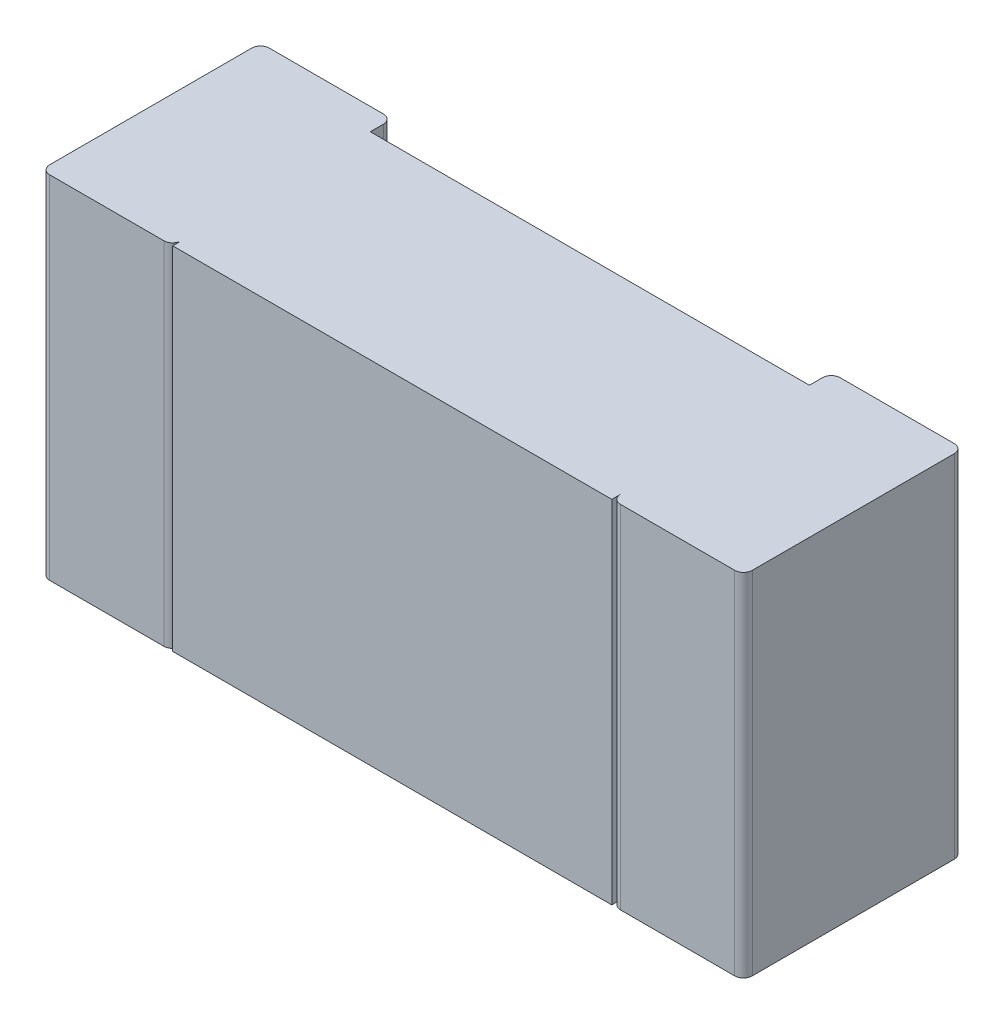
ISO-10303-21;
HEADER;
FILE_DESCRIPTION(('STEP AP214'),'2;1');
FILE_NAME('part.step','',(''),(''),'','','');
FILE_SCHEMA(('AUTOMOTIVE_DESIGN { 1 0 10303 214 1 1 1 1 }'));
ENDSEC;
DATA;
#1=APPLICATION_CONTEXT('core data for automotive mechanical design processes');
#2=APPLICATION_PROTOCOL_DEFINITION('international standard','automotive_design',2000,#1);
#3=PRODUCT_CONTEXT('',#1,'mechanical');
#4=PRODUCT('Part','Part','',(#3));
#5=PRODUCT_RELATED_PRODUCT_CATEGORY('part','',(#4));
#6=PRODUCT_DEFINITION_FORMATION('','',#4);
#7=PRODUCT_DEFINITION_CONTEXT('part definition',#1,'design');
#8=PRODUCT_DEFINITION('design','',#6,#7);
#9=PRODUCT_DEFINITION_SHAPE('','',#8);
#10=(LENGTH_UNIT() NAMED_UNIT(*) SI_UNIT(.MILLI.,.METRE.));
#11=(NAMED_UNIT(*) PLANE_ANGLE_UNIT() SI_UNIT($,.RADIAN.));
#12=(NAMED_UNIT(*) SI_UNIT($,.STERADIAN.) SOLID_ANGLE_UNIT());
#13=UNCERTAINTY_MEASURE_WITH_UNIT(LENGTH_MEASURE(1.E-05),#10,'distance_accuracy_value','');
#14=(GEOMETRIC_REPRESENTATION_CONTEXT(3) GLOBAL_UNCERTAINTY_ASSIGNED_CONTEXT((#13)) GLOBAL_UNIT_ASSIGNED_CONTEXT((#10,
#11,#12)) REPRESENTATION_CONTEXT('',''));
#15=CARTESIAN_POINT('',(0.,0.,0.));
#16=DIRECTION('',(0.,0.,1.));
#17=DIRECTION('',(1.,0.,0.));
#18=AXIS2_PLACEMENT_3D('',#15,#16,#17);
#19=CARTESIAN_POINT('',(-0.8,-0.4,0.));
#20=DIRECTION('',(0.,0.,1.));
#21=DIRECTION('',(1.,0.,0.));
#22=AXIS2_PLACEMENT_3D('',#19,#20,#21);
#23=PLANE('',#22);
#24=DIRECTION('',(1.,0.,0.));
#25=VECTOR('',#24,1.);
#26=CARTESIAN_POINT('',(-0.8,-0.4,0.));
#27=LINE('',#26,#25);
#28=CARTESIAN_POINT('',(-0.52,-0.4,0.));
#29=VERTEX_POINT('',#28);
#30=CARTESIAN_POINT('',(-0.78,-0.4,0.));
#31=VERTEX_POINT('',#30);
#32=EDGE_CURVE('E176',#29,#31,#27,.F.);
#33=ORIENTED_EDGE('',*,*,#32,.T.);
#34=DIRECTION('',(0.,1.,0.));
#35=VECTOR('',#34,1.);
#36=CARTESIAN_POINT('',(-0.78,-0.4,0.));
#37=LINE('',#36,#35);
#38=CARTESIAN_POINT('',(-0.78,0.4,0.));
#39=VERTEX_POINT('',#38);
#40=EDGE_CURVE('E151',#39,#31,#37,.F.);
#41=ORIENTED_EDGE('',*,*,#40,.F.);
#42=DIRECTION('',(1.,0.,0.));
#43=VECTOR('',#42,1.);
#44=CARTESIAN_POINT('',(-0.8,0.4,0.));
#45=LINE('',#44,#43);
#46=CARTESIAN_POINT('',(-0.52,0.4,0.));
#47=VERTEX_POINT('',#46);
#48=EDGE_CURVE('E286',#47,#39,#45,.F.);
#49=ORIENTED_EDGE('',*,*,#48,.F.);
#50=DIRECTION('',(0.,1.,0.));
#51=VECTOR('',#50,1.);
#52=CARTESIAN_POINT('',(-0.52,-0.4,0.));
#53=LINE('',#52,#51);
#54=EDGE_CURVE('E177',#29,#47,#53,.T.);
#55=ORIENTED_EDGE('',*,*,#54,.F.);
#56=EDGE_LOOP('',(#33,#41,#49,#55));
#57=FACE_BOUND('',#56,.T.);
#58=ADVANCED_FACE('F17',(#57),#23,.F.);
#59=CARTESIAN_POINT('',(-0.78,-0.4,0.02));
#60=DIRECTION('',(0.,1.,0.));
#61=DIRECTION('',(0.,0.,1.));
#62=AXIS2_PLACEMENT_3D('',#59,#60,#61);
#63=CYLINDRICAL_SURFACE('',#62,0.02);
#64=ORIENTED_EDGE('',*,*,#40,.T.);
#65=CARTESIAN_POINT('',(-0.78,-0.4,0.02));
#66=DIRECTION('',(0.,1.,0.));
#67=DIRECTION('',(0.,0.,1.));
#68=AXIS2_PLACEMENT_3D('',#65,#66,#67);
#69=CIRCLE('',#68,0.02);
#70=CARTESIAN_POINT('',(-0.8,-0.4,0.02));
#71=VERTEX_POINT('',#70);
#72=EDGE_CURVE('E20',#31,#71,#69,.T.);
#73=ORIENTED_EDGE('',*,*,#72,.T.);
#74=DIRECTION('',(0.,1.,0.));
#75=VECTOR('',#74,1.);
#76=CARTESIAN_POINT('',(-0.8,-0.4,0.02));
#77=LINE('',#76,#75);
#78=CARTESIAN_POINT('',(-0.8,0.4,0.02));
#79=VERTEX_POINT('',#78);
#80=EDGE_CURVE('E158',#71,#79,#77,.T.);
#81=ORIENTED_EDGE('',*,*,#80,.T.);
#82=CARTESIAN_POINT('',(-0.78,0.4,0.02));
#83=DIRECTION('',(0.,1.,0.));
#84=DIRECTION('',(0.,0.,1.));
#85=AXIS2_PLACEMENT_3D('',#82,#83,#84);
#86=CIRCLE('',#85,0.02);
#87=EDGE_CURVE('E284',#39,#79,#86,.T.);
#88=ORIENTED_EDGE('',*,*,#87,.F.);
#89=EDGE_LOOP('',(#64,#73,#81,#88));
#90=FACE_BOUND('',#89,.T.);
#91=ADVANCED_FACE('F175',(#90),#63,.T.);
#92=CARTESIAN_POINT('',(-0.8,-0.4,0.));
#93=DIRECTION('',(1.,0.,0.));
#94=DIRECTION('',(0.,0.,-1.));
#95=AXIS2_PLACEMENT_3D('',#92,#93,#94);
#96=PLANE('',#95);
#97=DIRECTION('',(0.,0.,1.));
#98=VECTOR('',#97,1.);
#99=CARTESIAN_POINT('',(-0.8,0.4,0.));
#100=LINE('',#99,#98);
#101=CARTESIAN_POINT('',(-0.8,0.4,0.48));
#102=VERTEX_POINT('',#101);
#103=EDGE_CURVE('E163',#79,#102,#100,.T.);
#104=ORIENTED_EDGE('',*,*,#103,.F.);
#105=ORIENTED_EDGE('',*,*,#80,.F.);
#106=DIRECTION('',(0.,0.,1.));
#107=VECTOR('',#106,1.);
#108=CARTESIAN_POINT('',(-0.8,-0.4,0.));
#109=LINE('',#108,#107);
#110=CARTESIAN_POINT('',(-0.8,-0.4,0.48));
#111=VERTEX_POINT('',#110);
#112=EDGE_CURVE('E162',#71,#111,#109,.T.);
#113=ORIENTED_EDGE('',*,*,#112,.T.);
#114=DIRECTION('',(0.,1.,0.));
#115=VECTOR('',#114,1.);
#116=CARTESIAN_POINT('',(-0.8,-0.4,0.48));
#117=LINE('',#116,#115);
#118=EDGE_CURVE('E164',#102,#111,#117,.F.);
#119=ORIENTED_EDGE('',*,*,#118,.F.);
#120=EDGE_LOOP('',(#104,#105,#113,#119));
#121=FACE_BOUND('',#120,.T.);
#122=ADVANCED_FACE('F160',(#121),#96,.F.);
#123=CARTESIAN_POINT('',(-0.78,-0.4,0.48));
#124=DIRECTION('',(0.,1.,0.));
#125=DIRECTION('',(0.,0.,1.));
#126=AXIS2_PLACEMENT_3D('',#123,#124,#125);
#127=CYLINDRICAL_SURFACE('',#126,0.02);
#128=CARTESIAN_POINT('',(-0.78,0.4,0.48));
#129=DIRECTION('',(0.,1.,0.));
#130=DIRECTION('',(0.,0.,1.));
#131=AXIS2_PLACEMENT_3D('',#128,#129,#130);
#132=CIRCLE('',#131,0.02);
#133=CARTESIAN_POINT('',(-0.78,0.4,0.5));
#134=VERTEX_POINT('',#133);
#135=EDGE_CURVE('E282',#102,#134,#132,.T.);
#136=ORIENTED_EDGE('',*,*,#135,.F.);
#137=ORIENTED_EDGE('',*,*,#118,.T.);
#138=CARTESIAN_POINT('',(-0.78,-0.4,0.48));
#139=DIRECTION('',(0.,1.,0.));
#140=DIRECTION('',(0.,0.,1.));
#141=AXIS2_PLACEMENT_3D('',#138,#139,#140);
#142=CIRCLE('',#141,0.02);
#143=CARTESIAN_POINT('',(-0.78,-0.4,0.5));
#144=VERTEX_POINT('',#143);
#145=EDGE_CURVE('E173',#111,#144,#142,.T.);
#146=ORIENTED_EDGE('',*,*,#145,.T.);
#147=DIRECTION('',(0.,1.,0.));
#148=VECTOR('',#147,1.);
#149=CARTESIAN_POINT('',(-0.78,-0.4,0.5));
#150=LINE('',#149,#148);
#151=EDGE_CURVE('E246',#134,#144,#150,.F.);
#152=ORIENTED_EDGE('',*,*,#151,.F.);
#153=EDGE_LOOP('',(#136,#137,#146,#152));
#154=FACE_BOUND('',#153,.T.);
#155=ADVANCED_FACE('F378',(#154),#127,.T.);
#156=CARTESIAN_POINT('',(-0.8,-0.4,0.5));
#157=DIRECTION('',(0.,0.,1.));
#158=DIRECTION('',(1.,0.,0.));
#159=AXIS2_PLACEMENT_3D('',#156,#157,#158);
#160=PLANE('',#159);
#161=DIRECTION('',(1.,0.,0.));
#162=VECTOR('',#161,1.);
#163=CARTESIAN_POINT('',(-0.8,-0.4,0.5));
#164=LINE('',#163,#162);
#165=CARTESIAN_POINT('',(-0.52,-0.4,0.5));
#166=VERTEX_POINT('',#165);
#167=EDGE_CURVE('E302',#144,#166,#164,.T.);
#168=ORIENTED_EDGE('',*,*,#167,.T.);
#169=DIRECTION('',(0.,1.,0.));
#170=VECTOR('',#169,1.);
#171=CARTESIAN_POINT('',(-0.52,-0.4,0.5));
#172=LINE('',#171,#170);
#173=CARTESIAN_POINT('',(-0.52,0.4,0.5));
#174=VERTEX_POINT('',#173);
#175=EDGE_CURVE('E243',#174,#166,#172,.F.);
#176=ORIENTED_EDGE('',*,*,#175,.F.);
#177=DIRECTION('',(1.,0.,0.));
#178=VECTOR('',#177,1.);
#179=CARTESIAN_POINT('',(-0.8,0.4,0.5));
#180=LINE('',#179,#178);
#181=EDGE_CURVE('E281',#134,#174,#180,.T.);
#182=ORIENTED_EDGE('',*,*,#181,.F.);
#183=ORIENTED_EDGE('',*,*,#151,.T.);
#184=EDGE_LOOP('',(#168,#176,#182,#183));
#185=FACE_BOUND('',#184,.T.);
#186=ADVANCED_FACE('F380',(#185),#160,.T.);
#187=CARTESIAN_POINT('',(-0.52,-0.4,0.48));
#188=DIRECTION('',(0.,1.,0.));
#189=DIRECTION('',(0.,0.,1.));
#190=AXIS2_PLACEMENT_3D('',#187,#188,#189);
#191=CYLINDRICAL_SURFACE('',#190,0.02);
#192=ORIENTED_EDGE('',*,*,#175,.T.);
#193=CARTESIAN_POINT('',(-0.52,-0.4,0.48));
#194=DIRECTION('',(0.,1.,0.));
#195=DIRECTION('',(0.,0.,1.));
#196=AXIS2_PLACEMENT_3D('',#193,#194,#195);
#197=CIRCLE('',#196,0.02);
#198=CARTESIAN_POINT('',(-0.5,-0.4,0.48));
#199=VERTEX_POINT('',#198);
#200=EDGE_CURVE('E300',#166,#199,#197,.T.);
#201=ORIENTED_EDGE('',*,*,#200,.T.);
#202=DIRECTION('',(0.,1.,0.));
#203=VECTOR('',#202,1.);
#204=CARTESIAN_POINT('',(-0.5,-0.4,0.48));
#205=LINE('',#204,#203);
#206=CARTESIAN_POINT('',(-0.5,0.4,0.48));
#207=VERTEX_POINT('',#206);
#208=EDGE_CURVE('E235',#199,#207,#205,.T.);
#209=ORIENTED_EDGE('',*,*,#208,.T.);
#210=CARTESIAN_POINT('',(-0.52,0.4,0.48));
#211=DIRECTION('',(0.,1.,0.));
#212=DIRECTION('',(0.,0.,1.));
#213=AXIS2_PLACEMENT_3D('',#210,#211,#212);
#214=CIRCLE('',#213,0.02);
#215=EDGE_CURVE('E279',#174,#207,#214,.T.);
#216=ORIENTED_EDGE('',*,*,#215,.F.);
#217=EDGE_LOOP('',(#192,#201,#209,#216));
#218=FACE_BOUND('',#217,.T.);
#219=ADVANCED_FACE('F385',(#218),#191,.T.);
#220=CARTESIAN_POINT('',(-0.5,-0.4,0.45));
#221=DIRECTION('',(1.,0.,0.));
#222=DIRECTION('',(0.,0.,-1.));
#223=AXIS2_PLACEMENT_3D('',#220,#221,#222);
#224=PLANE('',#223);
#225=DIRECTION('',(0.,0.,1.));
#226=VECTOR('',#225,1.);
#227=CARTESIAN_POINT('',(-0.5,0.4,0.45));
#228=LINE('',#227,#226);
#229=CARTESIAN_POINT('',(-0.5,0.4,0.5));
#230=VERTEX_POINT('',#229);
#231=EDGE_CURVE('E231',#207,#230,#228,.T.);
#232=ORIENTED_EDGE('',*,*,#231,.F.);
#233=ORIENTED_EDGE('',*,*,#208,.F.);
#234=DIRECTION('',(0.,0.,1.));
#235=VECTOR('',#234,1.);
#236=CARTESIAN_POINT('',(-0.5,-0.4,0.45));
#237=LINE('',#236,#235);
#238=CARTESIAN_POINT('',(-0.5,-0.4,0.5));
#239=VERTEX_POINT('',#238);
#240=EDGE_CURVE('E259',#199,#239,#237,.T.);
#241=ORIENTED_EDGE('',*,*,#240,.T.);
#242=DIRECTION('',(0.,1.,0.));
#243=VECTOR('',#242,1.);
#244=CARTESIAN_POINT('',(-0.5,-0.4,0.5));
#245=LINE('',#244,#243);
#246=EDGE_CURVE('E227',#230,#239,#245,.F.);
#247=ORIENTED_EDGE('',*,*,#246,.F.);
#248=EDGE_LOOP('',(#232,#233,#241,#247));
#249=FACE_BOUND('',#248,.T.);
#250=ADVANCED_FACE('F388',(#249),#224,.F.);
#251=CARTESIAN_POINT('',(-0.5,-0.4,0.5));
#252=DIRECTION('',(0.,0.,1.));
#253=DIRECTION('',(1.,0.,0.));
#254=AXIS2_PLACEMENT_3D('',#251,#252,#253);
#255=PLANE('',#254);
#256=DIRECTION('',(0.,1.,0.));
#257=VECTOR('',#256,1.);
#258=CARTESIAN_POINT('',(0.5,-0.4,0.5));
#259=LINE('',#258,#257);
#260=CARTESIAN_POINT('',(0.5,0.4,0.5));
#261=VERTEX_POINT('',#260);
#262=CARTESIAN_POINT('',(0.5,-0.4,0.5));
#263=VERTEX_POINT('',#262);
#264=EDGE_CURVE('E215',#261,#263,#259,.F.);
#265=ORIENTED_EDGE('',*,*,#264,.F.);
#266=DIRECTION('',(1.,0.,0.));
#267=VECTOR('',#266,1.);
#268=CARTESIAN_POINT('',(-0.5,0.4,0.5));
#269=LINE('',#268,#267);
#270=EDGE_CURVE('E219',#230,#261,#269,.T.);
#271=ORIENTED_EDGE('',*,*,#270,.F.);
#272=ORIENTED_EDGE('',*,*,#246,.T.);
#273=DIRECTION('',(1.,0.,0.));
#274=VECTOR('',#273,1.);
#275=CARTESIAN_POINT('',(-0.5,-0.4,0.5));
#276=LINE('',#275,#274);
#277=EDGE_CURVE('E254',#239,#263,#276,.T.);
#278=ORIENTED_EDGE('',*,*,#277,.T.);
#279=EDGE_LOOP('',(#265,#271,#272,#278));
#280=FACE_BOUND('',#279,.T.);
#281=ADVANCED_FACE('F393',(#280),#255,.T.);
#282=CARTESIAN_POINT('',(0.5,-0.4,0.45));
#283=DIRECTION('',(1.,0.,0.));
#284=DIRECTION('',(0.,0.,-1.));
#285=AXIS2_PLACEMENT_3D('',#282,#283,#284);
#286=PLANE('',#285);
#287=DIRECTION('',(0.,0.,1.));
#288=VECTOR('',#287,1.);
#289=CARTESIAN_POINT('',(0.5,0.4,0.45));
#290=LINE('',#289,#288);
#291=CARTESIAN_POINT('',(0.5,0.4,0.48));
#292=VERTEX_POINT('',#291);
#293=EDGE_CURVE('E216',#261,#292,#290,.F.);
#294=ORIENTED_EDGE('',*,*,#293,.F.);
#295=ORIENTED_EDGE('',*,*,#264,.T.);
#296=DIRECTION('',(0.,0.,1.));
#297=VECTOR('',#296,1.);
#298=CARTESIAN_POINT('',(0.5,-0.4,0.45));
#299=LINE('',#298,#297);
#300=CARTESIAN_POINT('',(0.5,-0.4,0.48));
#301=VERTEX_POINT('',#300);
#302=EDGE_CURVE('E250',#263,#301,#299,.F.);
#303=ORIENTED_EDGE('',*,*,#302,.T.);
#304=DIRECTION('',(0.,1.,0.));
#305=VECTOR('',#304,1.);
#306=CARTESIAN_POINT('',(0.5,-0.4,0.48));
#307=LINE('',#306,#305);
#308=EDGE_CURVE('E213',#292,#301,#307,.F.);
#309=ORIENTED_EDGE('',*,*,#308,.F.);
#310=EDGE_LOOP('',(#294,#295,#303,#309));
#311=FACE_BOUND('',#310,.T.);
#312=ADVANCED_FACE('F399',(#311),#286,.T.);
#313=CARTESIAN_POINT('',(0.5,-0.4,0.));
#314=DIRECTION('',(0.,0.,1.));
#315=DIRECTION('',(1.,0.,0.));
#316=AXIS2_PLACEMENT_3D('',#313,#314,#315);
#317=PLANE('',#316);
#318=DIRECTION('',(1.,0.,0.));
#319=VECTOR('',#318,1.);
#320=CARTESIAN_POINT('',(0.5,-0.4,0.));
#321=LINE('',#320,#319);
#322=CARTESIAN_POINT('',(0.78,-0.4,0.));
#323=VERTEX_POINT('',#322);
#324=CARTESIAN_POINT('',(0.52,-0.4,0.));
#325=VERTEX_POINT('',#324);
#326=EDGE_CURVE('E253',#323,#325,#321,.F.);
#327=ORIENTED_EDGE('',*,*,#326,.T.);
#328=DIRECTION('',(0.,1.,0.));
#329=VECTOR('',#328,1.);
#330=CARTESIAN_POINT('',(0.52,-0.4,0.));
#331=LINE('',#330,#329);
#332=CARTESIAN_POINT('',(0.52,0.4,0.));
#333=VERTEX_POINT('',#332);
#334=EDGE_CURVE('E222',#333,#325,#331,.F.);
#335=ORIENTED_EDGE('',*,*,#334,.F.);
#336=DIRECTION('',(1.,0.,0.));
#337=VECTOR('',#336,1.);
#338=CARTESIAN_POINT('',(0.5,0.4,0.));
#339=LINE('',#338,#337);
#340=CARTESIAN_POINT('',(0.78,0.4,0.));
#341=VERTEX_POINT('',#340);
#342=EDGE_CURVE('E218',#341,#333,#339,.F.);
#343=ORIENTED_EDGE('',*,*,#342,.F.);
#344=DIRECTION('',(0.,1.,0.));
#345=VECTOR('',#344,1.);
#346=CARTESIAN_POINT('',(0.78,-0.4,0.));
#347=LINE('',#346,#345);
#348=EDGE_CURVE('E204',#323,#341,#347,.T.);
#349=ORIENTED_EDGE('',*,*,#348,.F.);
#350=EDGE_LOOP('',(#327,#335,#343,#349));
#351=FACE_BOUND('',#350,.T.);
#352=ADVANCED_FACE('F355',(#351),#317,.F.);
#353=CARTESIAN_POINT('',(0.52,-0.4,0.48));
#354=DIRECTION('',(0.,1.,0.));
#355=DIRECTION('',(0.,0.,1.));
#356=AXIS2_PLACEMENT_3D('',#353,#354,#355);
#357=CYLINDRICAL_SURFACE('',#356,0.02);
#358=CARTESIAN_POINT('',(0.52,0.4,0.48));
#359=DIRECTION('',(0.,1.,0.));
#360=DIRECTION('',(0.,0.,1.));
#361=AXIS2_PLACEMENT_3D('',#358,#359,#360);
#362=CIRCLE('',#361,0.02);
#363=CARTESIAN_POINT('',(0.52,0.4,0.5));
#364=VERTEX_POINT('',#363);
#365=EDGE_CURVE('E273',#292,#364,#362,.T.);
#366=ORIENTED_EDGE('',*,*,#365,.F.);
#367=ORIENTED_EDGE('',*,*,#308,.T.);
#368=CARTESIAN_POINT('',(0.52,-0.4,0.48));
#369=DIRECTION('',(0.,1.,0.));
#370=DIRECTION('',(0.,0.,1.));
#371=AXIS2_PLACEMENT_3D('',#368,#369,#370);
#372=CIRCLE('',#371,0.02);
#373=CARTESIAN_POINT('',(0.52,-0.4,0.5));
#374=VERTEX_POINT('',#373);
#375=EDGE_CURVE('E295',#301,#374,#372,.T.);
#376=ORIENTED_EDGE('',*,*,#375,.T.);
#377=DIRECTION('',(0.,1.,0.));
#378=VECTOR('',#377,1.);
#379=CARTESIAN_POINT('',(0.52,-0.4,0.5));
#380=LINE('',#379,#378);
#381=EDGE_CURVE('E211',#364,#374,#380,.F.);
#382=ORIENTED_EDGE('',*,*,#381,.F.);
#383=EDGE_LOOP('',(#366,#367,#376,#382));
#384=FACE_BOUND('',#383,.T.);
#385=ADVANCED_FACE('F403',(#384),#357,.T.);
#386=CARTESIAN_POINT('',(0.5,-0.4,0.5));
#387=DIRECTION('',(0.,0.,1.));
#388=DIRECTION('',(1.,0.,0.));
#389=AXIS2_PLACEMENT_3D('',#386,#387,#388);
#390=PLANE('',#389);
#391=DIRECTION('',(1.,0.,0.));
#392=VECTOR('',#391,1.);
#393=CARTESIAN_POINT('',(0.5,-0.4,0.5));
#394=LINE('',#393,#392);
#395=CARTESIAN_POINT('',(0.78,-0.4,0.5));
#396=VERTEX_POINT('',#395);
#397=EDGE_CURVE('E294',#374,#396,#394,.T.);
#398=ORIENTED_EDGE('',*,*,#397,.T.);
#399=DIRECTION('',(0.,1.,0.));
#400=VECTOR('',#399,1.);
#401=CARTESIAN_POINT('',(0.78,-0.4,0.5));
#402=LINE('',#401,#400);
#403=CARTESIAN_POINT('',(0.78,0.4,0.5));
#404=VERTEX_POINT('',#403);
#405=EDGE_CURVE('E209',#404,#396,#402,.F.);
#406=ORIENTED_EDGE('',*,*,#405,.F.);
#407=DIRECTION('',(1.,0.,0.));
#408=VECTOR('',#407,1.);
#409=CARTESIAN_POINT('',(0.5,0.4,0.5));
#410=LINE('',#409,#408);
#411=EDGE_CURVE('E272',#364,#404,#410,.T.);
#412=ORIENTED_EDGE('',*,*,#411,.F.);
#413=ORIENTED_EDGE('',*,*,#381,.T.);
#414=EDGE_LOOP('',(#398,#406,#412,#413));
#415=FACE_BOUND('',#414,.T.);
#416=ADVANCED_FACE('F408',(#415),#390,.T.);
#417=CARTESIAN_POINT('',(0.78,-0.4,0.48));
#418=DIRECTION('',(0.,1.,0.));
#419=DIRECTION('',(0.,0.,1.));
#420=AXIS2_PLACEMENT_3D('',#417,#418,#419);
#421=CYLINDRICAL_SURFACE('',#420,0.02);
#422=ORIENTED_EDGE('',*,*,#405,.T.);
#423=CARTESIAN_POINT('',(0.78,-0.4,0.48));
#424=DIRECTION('',(0.,1.,0.));
#425=DIRECTION('',(0.,0.,1.));
#426=AXIS2_PLACEMENT_3D('',#423,#424,#425);
#427=CIRCLE('',#426,0.02);
#428=CARTESIAN_POINT('',(0.8,-0.4,0.48));
#429=VERTEX_POINT('',#428);
#430=EDGE_CURVE('E291',#396,#429,#427,.T.);
#431=ORIENTED_EDGE('',*,*,#430,.T.);
#432=DIRECTION('',(0.,1.,0.));
#433=VECTOR('',#432,1.);
#434=CARTESIAN_POINT('',(0.8,-0.4,0.48));
#435=LINE('',#434,#433);
#436=CARTESIAN_POINT('',(0.8,0.4,0.48));
#437=VERTEX_POINT('',#436);
#438=EDGE_CURVE('E206',#437,#429,#435,.F.);
#439=ORIENTED_EDGE('',*,*,#438,.F.);
#440=CARTESIAN_POINT('',(0.78,0.4,0.48));
#441=DIRECTION('',(0.,1.,0.));
#442=DIRECTION('',(0.,0.,1.));
#443=AXIS2_PLACEMENT_3D('',#440,#441,#442);
#444=CIRCLE('',#443,0.02);
#445=EDGE_CURVE('E270',#404,#437,#444,.T.);
#446=ORIENTED_EDGE('',*,*,#445,.F.);
#447=EDGE_LOOP('',(#422,#431,#439,#446));
#448=FACE_BOUND('',#447,.T.);
#449=ADVANCED_FACE('F411',(#448),#421,.T.);
#450=CARTESIAN_POINT('',(0.8,-0.4,0.));
#451=DIRECTION('',(1.,0.,0.));
#452=DIRECTION('',(0.,0.,-1.));
#453=AXIS2_PLACEMENT_3D('',#450,#451,#452);
#454=PLANE('',#453);
#455=DIRECTION('',(0.,0.,1.));
#456=VECTOR('',#455,1.);
#457=CARTESIAN_POINT('',(0.8,0.4,0.));
#458=LINE('',#457,#456);
#459=CARTESIAN_POINT('',(0.8,0.4,0.02));
#460=VERTEX_POINT('',#459);
#461=EDGE_CURVE('E269',#437,#460,#458,.F.);
#462=ORIENTED_EDGE('',*,*,#461,.F.);
#463=ORIENTED_EDGE('',*,*,#438,.T.);
#464=DIRECTION('',(0.,0.,1.));
#465=VECTOR('',#464,1.);
#466=CARTESIAN_POINT('',(0.8,-0.4,0.));
#467=LINE('',#466,#465);
#468=CARTESIAN_POINT('',(0.8,-0.4,0.02));
#469=VERTEX_POINT('',#468);
#470=EDGE_CURVE('E290',#429,#469,#467,.F.);
#471=ORIENTED_EDGE('',*,*,#470,.T.);
#472=DIRECTION('',(0.,1.,0.));
#473=VECTOR('',#472,1.);
#474=CARTESIAN_POINT('',(0.8,-0.4,0.02));
#475=LINE('',#474,#473);
#476=EDGE_CURVE('E181',#460,#469,#475,.F.);
#477=ORIENTED_EDGE('',*,*,#476,.F.);
#478=EDGE_LOOP('',(#462,#463,#471,#477));
#479=FACE_BOUND('',#478,.T.);
#480=ADVANCED_FACE('F348',(#479),#454,.T.);
#481=CARTESIAN_POINT('',(0.78,-0.4,0.02));
#482=DIRECTION('',(0.,1.,0.));
#483=DIRECTION('',(0.,0.,1.));
#484=AXIS2_PLACEMENT_3D('',#481,#482,#483);
#485=CYLINDRICAL_SURFACE('',#484,0.02);
#486=CARTESIAN_POINT('',(0.78,0.4,0.02));
#487=DIRECTION('',(0.,1.,0.));
#488=DIRECTION('',(0.,0.,1.));
#489=AXIS2_PLACEMENT_3D('',#486,#487,#488);
#490=CIRCLE('',#489,0.02);
#491=EDGE_CURVE('E189',#460,#341,#490,.T.);
#492=ORIENTED_EDGE('',*,*,#491,.F.);
#493=ORIENTED_EDGE('',*,*,#476,.T.);
#494=CARTESIAN_POINT('',(0.78,-0.4,0.02));
#495=DIRECTION('',(0.,1.,0.));
#496=DIRECTION('',(0.,0.,1.));
#497=AXIS2_PLACEMENT_3D('',#494,#495,#496);
#498=CIRCLE('',#497,0.02);
#499=EDGE_CURVE('E225',#469,#323,#498,.T.);
#500=ORIENTED_EDGE('',*,*,#499,.T.);
#501=ORIENTED_EDGE('',*,*,#348,.T.);
#502=EDGE_LOOP('',(#492,#493,#500,#501));
#503=FACE_BOUND('',#502,.T.);
#504=ADVANCED_FACE('F352',(#503),#485,.T.);
#505=CARTESIAN_POINT('',(-0.52,-0.4,0.02));
#506=DIRECTION('',(0.,1.,0.));
#507=DIRECTION('',(0.,0.,1.));
#508=AXIS2_PLACEMENT_3D('',#505,#506,#507);
#509=CYLINDRICAL_SURFACE('',#508,0.02);
#510=CARTESIAN_POINT('',(-0.52,0.4,0.02));
#511=DIRECTION('',(0.,1.,0.));
#512=DIRECTION('',(0.,0.,1.));
#513=AXIS2_PLACEMENT_3D('',#510,#511,#512);
#514=CIRCLE('',#513,0.02);
#515=CARTESIAN_POINT('',(-0.5,0.4,0.02));
#516=VERTEX_POINT('',#515);
#517=EDGE_CURVE('E239',#516,#47,#514,.T.);
#518=ORIENTED_EDGE('',*,*,#517,.F.);
#519=DIRECTION('',(0.,1.,0.));
#520=VECTOR('',#519,1.);
#521=CARTESIAN_POINT('',(-0.5,-0.4,0.02));
#522=LINE('',#521,#520);
#523=CARTESIAN_POINT('',(-0.5,-0.4,0.02));
#524=VERTEX_POINT('',#523);
#525=EDGE_CURVE('E188',#524,#516,#522,.T.);
#526=ORIENTED_EDGE('',*,*,#525,.F.);
#527=CARTESIAN_POINT('',(-0.52,-0.4,0.02));
#528=DIRECTION('',(0.,1.,0.));
#529=DIRECTION('',(0.,0.,1.));
#530=AXIS2_PLACEMENT_3D('',#527,#528,#529);
#531=CIRCLE('',#530,0.02);
#532=EDGE_CURVE('E264',#524,#29,#531,.T.);
#533=ORIENTED_EDGE('',*,*,#532,.T.);
#534=ORIENTED_EDGE('',*,*,#54,.T.);
#535=EDGE_LOOP('',(#518,#526,#533,#534));
#536=FACE_BOUND('',#535,.T.);
#537=ADVANCED_FACE('F376',(#536),#509,.T.);
#538=CARTESIAN_POINT('',(0.52,-0.4,0.02));
#539=DIRECTION('',(0.,1.,0.));
#540=DIRECTION('',(0.,0.,1.));
#541=AXIS2_PLACEMENT_3D('',#538,#539,#540);
#542=CYLINDRICAL_SURFACE('',#541,0.02);
#543=ORIENTED_EDGE('',*,*,#334,.T.);
#544=CARTESIAN_POINT('',(0.52,-0.4,0.02));
#545=DIRECTION('',(0.,1.,0.));
#546=DIRECTION('',(0.,0.,1.));
#547=AXIS2_PLACEMENT_3D('',#544,#545,#546);
#548=CIRCLE('',#547,0.02);
#549=CARTESIAN_POINT('',(0.5,-0.4,0.02));
#550=VERTEX_POINT('',#549);
#551=EDGE_CURVE('E224',#325,#550,#548,.T.);
#552=ORIENTED_EDGE('',*,*,#551,.T.);
#553=DIRECTION('',(0.,1.,0.));
#554=VECTOR('',#553,1.);
#555=CARTESIAN_POINT('',(0.5,-0.4,0.02));
#556=LINE('',#555,#554);
#557=CARTESIAN_POINT('',(0.5,0.4,0.02));
#558=VERTEX_POINT('',#557);
#559=EDGE_CURVE('E323',#550,#558,#556,.T.);
#560=ORIENTED_EDGE('',*,*,#559,.T.);
#561=CARTESIAN_POINT('',(0.52,0.4,0.02));
#562=DIRECTION('',(0.,1.,0.));
#563=DIRECTION('',(0.,0.,1.));
#564=AXIS2_PLACEMENT_3D('',#561,#562,#563);
#565=CIRCLE('',#564,0.02);
#566=EDGE_CURVE('E275',#333,#558,#565,.T.);
#567=ORIENTED_EDGE('',*,*,#566,.F.);
#568=EDGE_LOOP('',(#543,#552,#560,#567));
#569=FACE_BOUND('',#568,.T.);
#570=ADVANCED_FACE('F364',(#569),#542,.T.);
#571=CARTESIAN_POINT('',(-0.5,-0.4,0.));
#572=DIRECTION('',(1.,0.,0.));
#573=DIRECTION('',(0.,0.,-1.));
#574=AXIS2_PLACEMENT_3D('',#571,#572,#573);
#575=PLANE('',#574);
#576=DIRECTION('',(0.,0.,-1.));
#577=VECTOR('',#576,1.);
#578=CARTESIAN_POINT('',(-0.5,0.4,0.));
#579=LINE('',#578,#577);
#580=CARTESIAN_POINT('',(-0.5,0.4,0.05));
#581=VERTEX_POINT('',#580);
#582=EDGE_CURVE('E199',#516,#581,#579,.F.);
#583=ORIENTED_EDGE('',*,*,#582,.T.);
#584=DIRECTION('',(0.,1.,0.));
#585=VECTOR('',#584,1.);
#586=CARTESIAN_POINT('',(-0.5,-0.4,0.05));
#587=LINE('',#586,#585);
#588=CARTESIAN_POINT('',(-0.5,-0.4,0.05));
#589=VERTEX_POINT('',#588);
#590=EDGE_CURVE('E192',#581,#589,#587,.F.);
#591=ORIENTED_EDGE('',*,*,#590,.T.);
#592=DIRECTION('',(0.,0.,-1.));
#593=VECTOR('',#592,1.);
#594=CARTESIAN_POINT('',(-0.5,-0.4,0.));
#595=LINE('',#594,#593);
#596=EDGE_CURVE('E185',#589,#524,#595,.T.);
#597=ORIENTED_EDGE('',*,*,#596,.T.);
#598=ORIENTED_EDGE('',*,*,#525,.T.);
#599=EDGE_LOOP('',(#583,#591,#597,#598));
#600=FACE_BOUND('',#599,.T.);
#601=ADVANCED_FACE('F373',(#600),#575,.T.);
#602=CARTESIAN_POINT('',(-0.75,-0.4,0.05));
#603=DIRECTION('',(0.,1.,0.));
#604=DIRECTION('',(0.,0.,1.));
#605=AXIS2_PLACEMENT_3D('',#602,#603,#604);
#606=PLANE('',#605);
#607=ORIENTED_EDGE('',*,*,#240,.F.);
#608=ORIENTED_EDGE('',*,*,#200,.F.);
#609=ORIENTED_EDGE('',*,*,#167,.F.);
#610=ORIENTED_EDGE('',*,*,#145,.F.);
#611=ORIENTED_EDGE('',*,*,#112,.F.);
#612=ORIENTED_EDGE('',*,*,#72,.F.);
#613=ORIENTED_EDGE('',*,*,#32,.F.);
#614=ORIENTED_EDGE('',*,*,#532,.F.);
#615=ORIENTED_EDGE('',*,*,#596,.F.);
#616=DIRECTION('',(1.,0.,0.));
#617=VECTOR('',#616,1.);
#618=CARTESIAN_POINT('',(-0.75,-0.4,0.05));
#619=LINE('',#618,#617);
#620=CARTESIAN_POINT('',(0.5,-0.4,0.05));
#621=VERTEX_POINT('',#620);
#622=EDGE_CURVE('E195',#589,#621,#619,.T.);
#623=ORIENTED_EDGE('',*,*,#622,.T.);
#624=DIRECTION('',(0.,0.,-1.));
#625=VECTOR('',#624,1.);
#626=CARTESIAN_POINT('',(0.5,-0.4,0.));
#627=LINE('',#626,#625);
#628=EDGE_CURVE('E201',#621,#550,#627,.T.);
#629=ORIENTED_EDGE('',*,*,#628,.T.);
#630=ORIENTED_EDGE('',*,*,#551,.F.);
#631=ORIENTED_EDGE('',*,*,#326,.F.);
#632=ORIENTED_EDGE('',*,*,#499,.F.);
#633=ORIENTED_EDGE('',*,*,#470,.F.);
#634=ORIENTED_EDGE('',*,*,#430,.F.);
#635=ORIENTED_EDGE('',*,*,#397,.F.);
#636=ORIENTED_EDGE('',*,*,#375,.F.);
#637=ORIENTED_EDGE('',*,*,#302,.F.);
#638=ORIENTED_EDGE('',*,*,#277,.F.);
#639=EDGE_LOOP('',(#607,#608,#609,#610,#611,#612,#613,#614,#615,#623,#629,#630,#631,#632,#633,
#634,#635,#636,#637,#638));
#640=FACE_BOUND('',#639,.T.);
#641=ADVANCED_FACE('F169',(#640),#606,.F.);
#642=CARTESIAN_POINT('',(0.5,-0.4,0.));
#643=DIRECTION('',(1.,0.,0.));
#644=DIRECTION('',(0.,0.,-1.));
#645=AXIS2_PLACEMENT_3D('',#642,#643,#644);
#646=PLANE('',#645);
#647=DIRECTION('',(0.,0.,-1.));
#648=VECTOR('',#647,1.);
#649=CARTESIAN_POINT('',(0.5,0.4,0.));
#650=LINE('',#649,#648);
#651=CARTESIAN_POINT('',(0.5,0.4,0.05));
#652=VERTEX_POINT('',#651);
#653=EDGE_CURVE('E34',#558,#652,#650,.F.);
#654=ORIENTED_EDGE('',*,*,#653,.F.);
#655=ORIENTED_EDGE('',*,*,#559,.F.);
#656=ORIENTED_EDGE('',*,*,#628,.F.);
#657=DIRECTION('',(0.,1.,0.));
#658=VECTOR('',#657,1.);
#659=CARTESIAN_POINT('',(0.5,-0.4,0.05));
#660=LINE('',#659,#658);
#661=EDGE_CURVE('E26',#621,#652,#660,.T.);
#662=ORIENTED_EDGE('',*,*,#661,.T.);
#663=EDGE_LOOP('',(#654,#655,#656,#662));
#664=FACE_BOUND('',#663,.T.);
#665=ADVANCED_FACE('F362',(#664),#646,.F.);
#666=CARTESIAN_POINT('',(-0.75,0.4,0.05));
#667=DIRECTION('',(0.,1.,0.));
#668=DIRECTION('',(0.,0.,1.));
#669=AXIS2_PLACEMENT_3D('',#666,#667,#668);
#670=PLANE('',#669);
#671=ORIENTED_EDGE('',*,*,#215,.T.);
#672=ORIENTED_EDGE('',*,*,#231,.T.);
#673=ORIENTED_EDGE('',*,*,#270,.T.);
#674=ORIENTED_EDGE('',*,*,#293,.T.);
#675=ORIENTED_EDGE('',*,*,#365,.T.);
#676=ORIENTED_EDGE('',*,*,#411,.T.);
#677=ORIENTED_EDGE('',*,*,#445,.T.);
#678=ORIENTED_EDGE('',*,*,#461,.T.);
#679=ORIENTED_EDGE('',*,*,#491,.T.);
#680=ORIENTED_EDGE('',*,*,#342,.T.);
#681=ORIENTED_EDGE('',*,*,#566,.T.);
#682=ORIENTED_EDGE('',*,*,#653,.T.);
#683=DIRECTION('',(1.,0.,0.));
#684=VECTOR('',#683,1.);
#685=CARTESIAN_POINT('',(-0.75,0.4,0.05));
#686=LINE('',#685,#684);
#687=EDGE_CURVE('E11',#652,#581,#686,.F.);
#688=ORIENTED_EDGE('',*,*,#687,.T.);
#689=ORIENTED_EDGE('',*,*,#582,.F.);
#690=ORIENTED_EDGE('',*,*,#517,.T.);
#691=ORIENTED_EDGE('',*,*,#48,.T.);
#692=ORIENTED_EDGE('',*,*,#87,.T.);
#693=ORIENTED_EDGE('',*,*,#103,.T.);
#694=ORIENTED_EDGE('',*,*,#135,.T.);
#695=ORIENTED_EDGE('',*,*,#181,.T.);
#696=EDGE_LOOP('',(#671,#672,#673,#674,#675,#676,#677,#678,#679,#680,#681,#682,#688,#689,#690,
#691,#692,#693,#694,#695));
#697=FACE_BOUND('',#696,.T.);
#698=ADVANCED_FACE('F342',(#697),#670,.T.);
#699=CARTESIAN_POINT('',(-0.75,-0.4,0.05));
#700=DIRECTION('',(0.,0.,1.));
#701=DIRECTION('',(1.,0.,0.));
#702=AXIS2_PLACEMENT_3D('',#699,#700,#701);
#703=PLANE('',#702);
#704=ORIENTED_EDGE('',*,*,#661,.F.);
#705=ORIENTED_EDGE('',*,*,#622,.F.);
#706=ORIENTED_EDGE('',*,*,#590,.F.);
#707=ORIENTED_EDGE('',*,*,#687,.F.);
#708=EDGE_LOOP('',(#704,#705,#706,#707));
#709=FACE_BOUND('',#708,.T.);
#710=ADVANCED_FACE('F367',(#709),#703,.F.);
#711=CLOSED_SHELL('',(#58,#91,#122,#155,#186,#219,#250,#281,#312,#352,#385,#416,#449,#480,#504,
#537,#570,#601,#641,#665,#698,#710));
#712=MANIFOLD_SOLID_BREP('B1',#711);
#713=ADVANCED_BREP_SHAPE_REPRESENTATION('',(#18,#712),#14);
#714=SHAPE_DEFINITION_REPRESENTATION(#9,#713);
ENDSEC;
END-ISO-10303-21;
